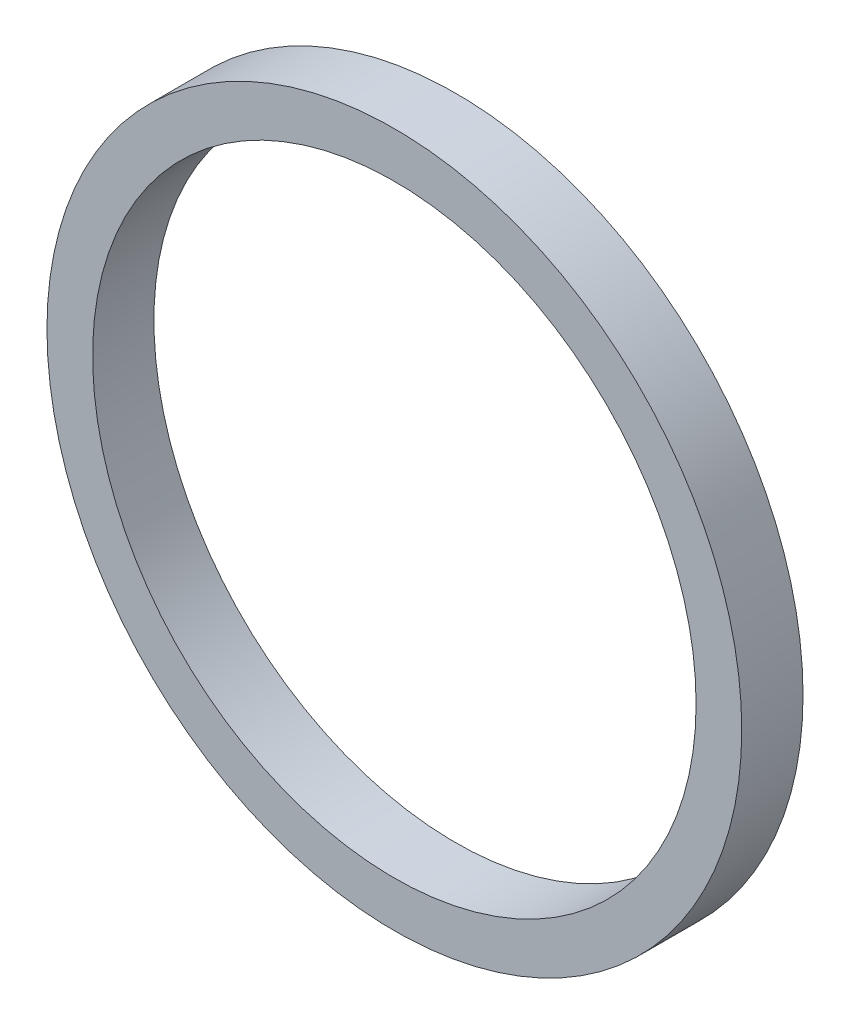
ISO-10303-21;
HEADER;
FILE_DESCRIPTION(('STEP AP214'),'2;1');
FILE_NAME('part.step','',(''),(''),'','','');
FILE_SCHEMA(('AUTOMOTIVE_DESIGN { 1 0 10303 214 1 1 1 1 }'));
ENDSEC;
DATA;
#1=APPLICATION_CONTEXT('core data for automotive mechanical design processes');
#2=APPLICATION_PROTOCOL_DEFINITION('international standard','automotive_design',2000,#1);
#3=PRODUCT_CONTEXT('',#1,'mechanical');
#4=PRODUCT('Part','Part','',(#3));
#5=PRODUCT_RELATED_PRODUCT_CATEGORY('part','',(#4));
#6=PRODUCT_DEFINITION_FORMATION('','',#4);
#7=PRODUCT_DEFINITION_CONTEXT('part definition',#1,'design');
#8=PRODUCT_DEFINITION('design','',#6,#7);
#9=PRODUCT_DEFINITION_SHAPE('','',#8);
#10=(LENGTH_UNIT() NAMED_UNIT(*) SI_UNIT(.MILLI.,.METRE.));
#11=(NAMED_UNIT(*) PLANE_ANGLE_UNIT() SI_UNIT($,.RADIAN.));
#12=(NAMED_UNIT(*) SI_UNIT($,.STERADIAN.) SOLID_ANGLE_UNIT());
#13=UNCERTAINTY_MEASURE_WITH_UNIT(LENGTH_MEASURE(1.E-05),#10,'distance_accuracy_value','');
#14=(GEOMETRIC_REPRESENTATION_CONTEXT(3) GLOBAL_UNCERTAINTY_ASSIGNED_CONTEXT((#13)) GLOBAL_UNIT_ASSIGNED_CONTEXT((#10,
#11,#12)) REPRESENTATION_CONTEXT('',''));
#15=CARTESIAN_POINT('',(0.,0.,0.));
#16=DIRECTION('',(0.,0.,1.));
#17=DIRECTION('',(1.,0.,0.));
#18=AXIS2_PLACEMENT_3D('',#15,#16,#17);
#19=CARTESIAN_POINT('',(3.68962912087912,0.,1.508125));
#20=DIRECTION('',(0.,0.,1.));
#21=DIRECTION('',(1.,0.,0.));
#22=AXIS2_PLACEMENT_3D('',#19,#20,#21);
#23=PLANE('',#22);
#24=CARTESIAN_POINT('',(0.,0.,1.508125));
#25=DIRECTION('',(0.,0.,1.));
#26=DIRECTION('',(1.,0.,0.));
#27=AXIS2_PLACEMENT_3D('',#24,#25,#26);
#28=CIRCLE('',#27,4.24787087912088);
#29=CARTESIAN_POINT('',(4.24787087912088,0.,1.508125));
#30=VERTEX_POINT('',#29);
#31=EDGE_CURVE('E10',#30,#30,#28,.T.);
#32=ORIENTED_EDGE('',*,*,#31,.T.);
#33=EDGE_LOOP('',(#32));
#34=FACE_BOUND('',#33,.T.);
#35=CARTESIAN_POINT('',(0.,0.,1.508125));
#36=DIRECTION('',(0.,0.,1.));
#37=DIRECTION('',(1.,0.,0.));
#38=AXIS2_PLACEMENT_3D('',#35,#36,#37);
#39=CIRCLE('',#38,3.68962912087912);
#40=CARTESIAN_POINT('',(3.68962912087912,0.,1.508125));
#41=VERTEX_POINT('',#40);
#42=EDGE_CURVE('E50',#41,#41,#39,.T.);
#43=ORIENTED_EDGE('',*,*,#42,.F.);
#44=EDGE_LOOP('',(#43));
#45=FACE_BOUND('',#44,.T.);
#46=ADVANCED_FACE('F36',(#34,#45),#23,.T.);
#47=CARTESIAN_POINT('',(0.,0.,0.758760243513404));
#48=DIRECTION('',(0.,0.,1.));
#49=DIRECTION('',(1.,0.,0.));
#50=AXIS2_PLACEMENT_3D('',#47,#48,#49);
#51=CYLINDRICAL_SURFACE('',#50,4.24787087912088);
#52=CARTESIAN_POINT('',(0.,0.,0.758760243513404));
#53=DIRECTION('',(0.,0.,1.));
#54=DIRECTION('',(1.,0.,0.));
#55=AXIS2_PLACEMENT_3D('',#52,#53,#54);
#56=CIRCLE('',#55,4.24787087912088);
#57=CARTESIAN_POINT('',(4.24787087912088,0.,0.758760243513404));
#58=VERTEX_POINT('',#57);
#59=EDGE_CURVE('E42',#58,#58,#56,.T.);
#60=ORIENTED_EDGE('',*,*,#59,.T.);
#61=EDGE_LOOP('',(#60));
#62=FACE_BOUND('',#61,.T.);
#63=ORIENTED_EDGE('',*,*,#31,.F.);
#64=EDGE_LOOP('',(#63));
#65=FACE_BOUND('',#64,.T.);
#66=ADVANCED_FACE('F60',(#62,#65),#51,.T.);
#67=CARTESIAN_POINT('',(4.24787087912088,0.,0.758760243513404));
#68=DIRECTION('',(0.,0.,-1.));
#69=DIRECTION('',(-1.,0.,0.));
#70=AXIS2_PLACEMENT_3D('',#67,#68,#69);
#71=PLANE('',#70);
#72=CARTESIAN_POINT('',(0.,0.,0.758760243513404));
#73=DIRECTION('',(0.,0.,1.));
#74=DIRECTION('',(1.,0.,0.));
#75=AXIS2_PLACEMENT_3D('',#72,#73,#74);
#76=CIRCLE('',#75,3.68962912087912);
#77=CARTESIAN_POINT('',(3.68962912087912,0.,0.758760243513404));
#78=VERTEX_POINT('',#77);
#79=EDGE_CURVE('E46',#78,#78,#76,.T.);
#80=ORIENTED_EDGE('',*,*,#79,.T.);
#81=EDGE_LOOP('',(#80));
#82=FACE_BOUND('',#81,.T.);
#83=ORIENTED_EDGE('',*,*,#59,.F.);
#84=EDGE_LOOP('',(#83));
#85=FACE_BOUND('',#84,.T.);
#86=ADVANCED_FACE('F64',(#82,#85),#71,.T.);
#87=CARTESIAN_POINT('',(0.,0.,0.758760243513404));
#88=DIRECTION('',(0.,0.,1.));
#89=DIRECTION('',(1.,0.,0.));
#90=AXIS2_PLACEMENT_3D('',#87,#88,#89);
#91=CYLINDRICAL_SURFACE('',#90,3.68962912087912);
#92=ORIENTED_EDGE('',*,*,#42,.T.);
#93=EDGE_LOOP('',(#92));
#94=FACE_BOUND('',#93,.T.);
#95=ORIENTED_EDGE('',*,*,#79,.F.);
#96=EDGE_LOOP('',(#95));
#97=FACE_BOUND('',#96,.T.);
#98=ADVANCED_FACE('F56',(#94,#97),#91,.F.);
#99=CLOSED_SHELL('',(#46,#66,#86,#98));
#100=MANIFOLD_SOLID_BREP('B2',#99);
#101=ADVANCED_BREP_SHAPE_REPRESENTATION('',(#18,#100),#14);
#102=SHAPE_DEFINITION_REPRESENTATION(#9,#101);
ENDSEC;
END-ISO-10303-21;
